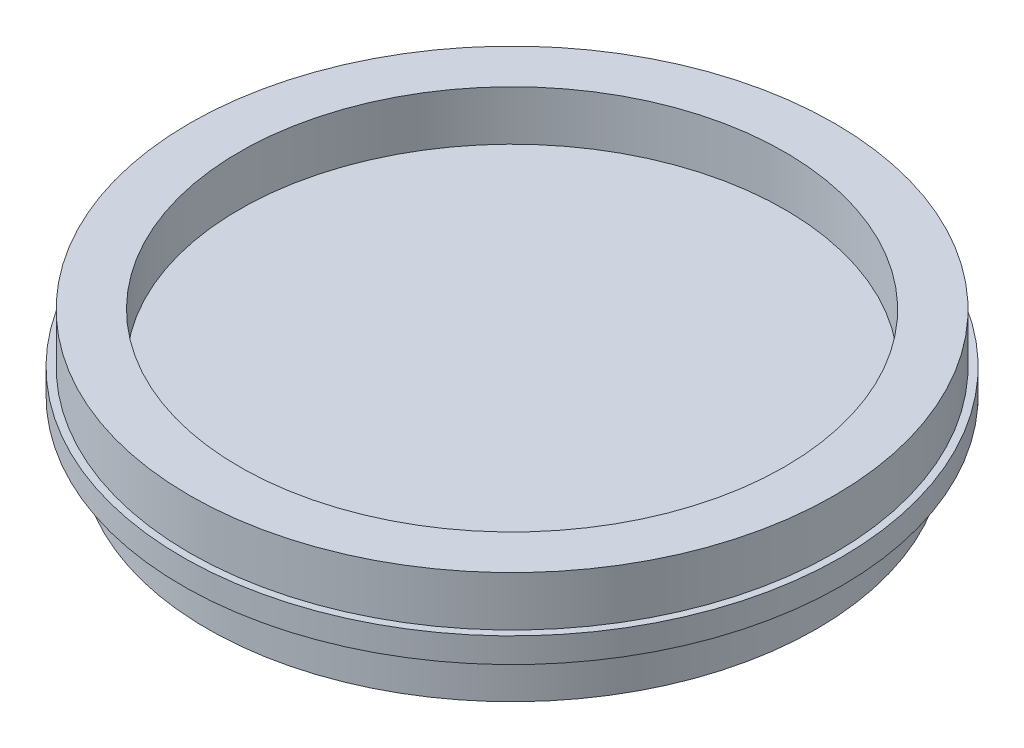
ISO-10303-21;
HEADER;
FILE_DESCRIPTION(('STEP AP214'),'2;1');
FILE_NAME('part.step','',(''),(''),'','','');
FILE_SCHEMA(('AUTOMOTIVE_DESIGN { 1 0 10303 214 1 1 1 1 }'));
ENDSEC;
DATA;
#1=APPLICATION_CONTEXT('core data for automotive mechanical design processes');
#2=APPLICATION_PROTOCOL_DEFINITION('international standard','automotive_design',2000,#1);
#3=PRODUCT_CONTEXT('',#1,'mechanical');
#4=PRODUCT('Part','Part','',(#3));
#5=PRODUCT_RELATED_PRODUCT_CATEGORY('part','',(#4));
#6=PRODUCT_DEFINITION_FORMATION('','',#4);
#7=PRODUCT_DEFINITION_CONTEXT('part definition',#1,'design');
#8=PRODUCT_DEFINITION('design','',#6,#7);
#9=PRODUCT_DEFINITION_SHAPE('','',#8);
#10=(LENGTH_UNIT() NAMED_UNIT(*) SI_UNIT(.MILLI.,.METRE.));
#11=(NAMED_UNIT(*) PLANE_ANGLE_UNIT() SI_UNIT($,.RADIAN.));
#12=(NAMED_UNIT(*) SI_UNIT($,.STERADIAN.) SOLID_ANGLE_UNIT());
#13=UNCERTAINTY_MEASURE_WITH_UNIT(LENGTH_MEASURE(1.E-05),#10,'distance_accuracy_value','');
#14=(GEOMETRIC_REPRESENTATION_CONTEXT(3) GLOBAL_UNCERTAINTY_ASSIGNED_CONTEXT((#13)) GLOBAL_UNIT_ASSIGNED_CONTEXT((#10,
#11,#12)) REPRESENTATION_CONTEXT('',''));
#15=CARTESIAN_POINT('',(0.,0.,0.));
#16=DIRECTION('',(0.,0.,1.));
#17=DIRECTION('',(1.,0.,0.));
#18=AXIS2_PLACEMENT_3D('',#15,#16,#17);
#19=CARTESIAN_POINT('',(0.,0.,0.));
#20=DIRECTION('',(0.,-1.,0.));
#21=DIRECTION('',(1.,0.,0.));
#22=AXIS2_PLACEMENT_3D('',#19,#20,#21);
#23=CYLINDRICAL_SURFACE('',#22,84.1374999999998);
#24=CARTESIAN_POINT('',(-1.84780982659883E-13,3454.4,0.));
#25=DIRECTION('',(0.,-1.,0.));
#26=DIRECTION('',(1.,0.,0.));
#27=AXIS2_PLACEMENT_3D('',#24,#25,#26);
#28=CIRCLE('',#27,84.1374999999998);
#29=CARTESIAN_POINT('',(84.1374999999996,3454.4,0.));
#30=VERTEX_POINT('',#29);
#31=EDGE_CURVE('E65',#30,#30,#28,.T.);
#32=ORIENTED_EDGE('',*,*,#31,.F.);
#33=EDGE_LOOP('',(#32));
#34=FACE_BOUND('',#33,.T.);
#35=CARTESIAN_POINT('',(-1.8512065358389E-13,3460.75,0.));
#36=DIRECTION('',(0.,-1.,0.));
#37=DIRECTION('',(1.,0.,0.));
#38=AXIS2_PLACEMENT_3D('',#35,#36,#37);
#39=CIRCLE('',#38,84.1374999999998);
#40=CARTESIAN_POINT('',(84.1374999999996,3460.75,0.));
#41=VERTEX_POINT('',#40);
#42=EDGE_CURVE('E10',#41,#41,#39,.T.);
#43=ORIENTED_EDGE('',*,*,#42,.T.);
#44=EDGE_LOOP('',(#43));
#45=FACE_BOUND('',#44,.T.);
#46=ADVANCED_FACE('F31',(#34,#45),#23,.T.);
#47=CARTESIAN_POINT('',(-84.1375,3460.75,0.));
#48=DIRECTION('',(0.,-1.,0.));
#49=DIRECTION('',(1.,0.,0.));
#50=AXIS2_PLACEMENT_3D('',#47,#48,#49);
#51=PLANE('',#50);
#52=ORIENTED_EDGE('',*,*,#42,.F.);
#53=EDGE_LOOP('',(#52));
#54=FACE_BOUND('',#53,.T.);
#55=CARTESIAN_POINT('',(-1.8512065358389E-13,3460.75,0.));
#56=DIRECTION('',(0.,-1.,0.));
#57=DIRECTION('',(1.,0.,0.));
#58=AXIS2_PLACEMENT_3D('',#55,#56,#57);
#59=CIRCLE('',#58,82.3086999999998);
#60=CARTESIAN_POINT('',(82.3086999999996,3460.75,0.));
#61=VERTEX_POINT('',#60);
#62=EDGE_CURVE('E37',#61,#61,#59,.T.);
#63=ORIENTED_EDGE('',*,*,#62,.T.);
#64=EDGE_LOOP('',(#63));
#65=FACE_BOUND('',#64,.T.);
#66=ADVANCED_FACE('F72',(#54,#65),#51,.F.);
#67=CARTESIAN_POINT('',(0.,0.,0.));
#68=DIRECTION('',(0.,-1.,0.));
#69=DIRECTION('',(1.,0.,0.));
#70=AXIS2_PLACEMENT_3D('',#67,#68,#69);
#71=CYLINDRICAL_SURFACE('',#70,82.3086999999998);
#72=ORIENTED_EDGE('',*,*,#62,.F.);
#73=EDGE_LOOP('',(#72));
#74=FACE_BOUND('',#73,.T.);
#75=CARTESIAN_POINT('',(-1.85799995431904E-13,3473.45,0.));
#76=DIRECTION('',(0.,-1.,0.));
#77=DIRECTION('',(1.,0.,0.));
#78=AXIS2_PLACEMENT_3D('',#75,#76,#77);
#79=CIRCLE('',#78,82.3086999999998);
#80=CARTESIAN_POINT('',(82.3086999999996,3473.45,0.));
#81=VERTEX_POINT('',#80);
#82=EDGE_CURVE('E41',#81,#81,#79,.T.);
#83=ORIENTED_EDGE('',*,*,#82,.T.);
#84=EDGE_LOOP('',(#83));
#85=FACE_BOUND('',#84,.T.);
#86=ADVANCED_FACE('F76',(#74,#85),#71,.T.);
#87=CARTESIAN_POINT('',(-82.3087,3473.45,0.));
#88=DIRECTION('',(0.,-1.,0.));
#89=DIRECTION('',(1.,0.,0.));
#90=AXIS2_PLACEMENT_3D('',#87,#88,#89);
#91=PLANE('',#90);
#92=ORIENTED_EDGE('',*,*,#82,.F.);
#93=EDGE_LOOP('',(#92));
#94=FACE_BOUND('',#93,.T.);
#95=CARTESIAN_POINT('',(-1.85799995431904E-13,3473.45,0.));
#96=DIRECTION('',(0.,-1.,0.));
#97=DIRECTION('',(1.,0.,0.));
#98=AXIS2_PLACEMENT_3D('',#95,#96,#97);
#99=CIRCLE('',#98,69.6086999999998);
#100=CARTESIAN_POINT('',(69.6086999999996,3473.45,0.));
#101=VERTEX_POINT('',#100);
#102=EDGE_CURVE('E45',#101,#101,#99,.T.);
#103=ORIENTED_EDGE('',*,*,#102,.T.);
#104=EDGE_LOOP('',(#103));
#105=FACE_BOUND('',#104,.T.);
#106=ADVANCED_FACE('F81',(#94,#105),#91,.F.);
#107=CARTESIAN_POINT('',(0.,0.,0.));
#108=DIRECTION('',(0.,-1.,0.));
#109=DIRECTION('',(1.,0.,0.));
#110=AXIS2_PLACEMENT_3D('',#107,#108,#109);
#111=CYLINDRICAL_SURFACE('',#110,69.6086999999998);
#112=ORIENTED_EDGE('',*,*,#102,.F.);
#113=EDGE_LOOP('',(#112));
#114=FACE_BOUND('',#113,.T.);
#115=CARTESIAN_POINT('',(-1.8512065358389E-13,3460.75,0.));
#116=DIRECTION('',(0.,-1.,0.));
#117=DIRECTION('',(1.,0.,0.));
#118=AXIS2_PLACEMENT_3D('',#115,#116,#117);
#119=CIRCLE('',#118,69.6086999999998);
#120=CARTESIAN_POINT('',(69.6086999999996,3460.75,0.));
#121=VERTEX_POINT('',#120);
#122=EDGE_CURVE('E50',#121,#121,#119,.T.);
#123=ORIENTED_EDGE('',*,*,#122,.T.);
#124=EDGE_LOOP('',(#123));
#125=FACE_BOUND('',#124,.T.);
#126=ADVANCED_FACE('F87',(#114,#125),#111,.F.);
#127=CARTESIAN_POINT('',(-69.6087,3460.75,0.));
#128=DIRECTION('',(0.,-1.,0.));
#129=DIRECTION('',(1.,0.,0.));
#130=AXIS2_PLACEMENT_3D('',#127,#128,#129);
#131=PLANE('',#130);
#132=ORIENTED_EDGE('',*,*,#122,.F.);
#133=EDGE_LOOP('',(#132));
#134=FACE_BOUND('',#133,.T.);
#135=ADVANCED_FACE('F91',(#134),#131,.F.);
#136=CARTESIAN_POINT('',(-65.0875,3454.4,0.));
#137=DIRECTION('',(0.,1.,0.));
#138=DIRECTION('',(-1.,0.,0.));
#139=AXIS2_PLACEMENT_3D('',#136,#137,#138);
#140=PLANE('',#139);
#141=CARTESIAN_POINT('',(-1.84780982659883E-13,3454.4,0.));
#142=DIRECTION('',(0.,-1.,0.));
#143=DIRECTION('',(1.,0.,0.));
#144=AXIS2_PLACEMENT_3D('',#141,#142,#143);
#145=CIRCLE('',#144,65.0874999999999);
#146=CARTESIAN_POINT('',(65.0874999999997,3454.4,0.));
#147=VERTEX_POINT('',#146);
#148=EDGE_CURVE('E53',#147,#147,#145,.T.);
#149=ORIENTED_EDGE('',*,*,#148,.T.);
#150=EDGE_LOOP('',(#149));
#151=FACE_BOUND('',#150,.T.);
#152=ADVANCED_FACE('F95',(#151),#140,.F.);
#153=CARTESIAN_POINT('',(0.,0.,0.));
#154=DIRECTION('',(0.,-1.,0.));
#155=DIRECTION('',(1.,0.,0.));
#156=AXIS2_PLACEMENT_3D('',#153,#154,#155);
#157=CYLINDRICAL_SURFACE('',#156,65.0874999999999);
#158=ORIENTED_EDGE('',*,*,#148,.F.);
#159=EDGE_LOOP('',(#158));
#160=FACE_BOUND('',#159,.T.);
#161=CARTESIAN_POINT('',(-1.84101640811869E-13,3441.7,0.));
#162=DIRECTION('',(0.,-1.,0.));
#163=DIRECTION('',(1.,0.,0.));
#164=AXIS2_PLACEMENT_3D('',#161,#162,#163);
#165=CIRCLE('',#164,65.0874999999999);
#166=CARTESIAN_POINT('',(65.0874999999997,3441.7,0.));
#167=VERTEX_POINT('',#166);
#168=EDGE_CURVE('E56',#167,#167,#165,.T.);
#169=ORIENTED_EDGE('',*,*,#168,.T.);
#170=EDGE_LOOP('',(#169));
#171=FACE_BOUND('',#170,.T.);
#172=ADVANCED_FACE('F99',(#160,#171),#157,.F.);
#173=CARTESIAN_POINT('',(-65.0875,3441.7,0.));
#174=DIRECTION('',(0.,1.,0.));
#175=DIRECTION('',(-1.,0.,0.));
#176=AXIS2_PLACEMENT_3D('',#173,#174,#175);
#177=PLANE('',#176);
#178=ORIENTED_EDGE('',*,*,#168,.F.);
#179=EDGE_LOOP('',(#178));
#180=FACE_BOUND('',#179,.T.);
#181=CARTESIAN_POINT('',(-1.84101640811869E-13,3441.7,0.));
#182=DIRECTION('',(0.,-1.,0.));
#183=DIRECTION('',(1.,0.,0.));
#184=AXIS2_PLACEMENT_3D('',#181,#182,#183);
#185=CIRCLE('',#184,77.7874999999999);
#186=CARTESIAN_POINT('',(77.7874999999997,3441.7,0.));
#187=VERTEX_POINT('',#186);
#188=EDGE_CURVE('E59',#187,#187,#185,.T.);
#189=ORIENTED_EDGE('',*,*,#188,.T.);
#190=EDGE_LOOP('',(#189));
#191=FACE_BOUND('',#190,.T.);
#192=ADVANCED_FACE('F103',(#180,#191),#177,.F.);
#193=CARTESIAN_POINT('',(0.,0.,0.));
#194=DIRECTION('',(0.,-1.,0.));
#195=DIRECTION('',(1.,0.,0.));
#196=AXIS2_PLACEMENT_3D('',#193,#194,#195);
#197=CYLINDRICAL_SURFACE('',#196,77.7874999999999);
#198=ORIENTED_EDGE('',*,*,#188,.F.);
#199=EDGE_LOOP('',(#198));
#200=FACE_BOUND('',#199,.T.);
#201=CARTESIAN_POINT('',(-1.84780982659883E-13,3454.4,0.));
#202=DIRECTION('',(0.,-1.,0.));
#203=DIRECTION('',(1.,0.,0.));
#204=AXIS2_PLACEMENT_3D('',#201,#202,#203);
#205=CIRCLE('',#204,77.7874999999999);
#206=CARTESIAN_POINT('',(77.7874999999997,3454.4,0.));
#207=VERTEX_POINT('',#206);
#208=EDGE_CURVE('E62',#207,#207,#205,.T.);
#209=ORIENTED_EDGE('',*,*,#208,.T.);
#210=EDGE_LOOP('',(#209));
#211=FACE_BOUND('',#210,.T.);
#212=ADVANCED_FACE('F107',(#200,#211),#197,.T.);
#213=CARTESIAN_POINT('',(-77.7875,3454.4,0.));
#214=DIRECTION('',(0.,1.,0.));
#215=DIRECTION('',(-1.,0.,0.));
#216=AXIS2_PLACEMENT_3D('',#213,#214,#215);
#217=PLANE('',#216);
#218=ORIENTED_EDGE('',*,*,#208,.F.);
#219=EDGE_LOOP('',(#218));
#220=FACE_BOUND('',#219,.T.);
#221=ORIENTED_EDGE('',*,*,#31,.T.);
#222=EDGE_LOOP('',(#221));
#223=FACE_BOUND('',#222,.T.);
#224=ADVANCED_FACE('F69',(#220,#223),#217,.F.);
#225=CLOSED_SHELL('',(#46,#66,#86,#106,#126,#135,#152,#172,#192,#212,#224));
#226=MANIFOLD_SOLID_BREP('B2',#225);
#227=ADVANCED_BREP_SHAPE_REPRESENTATION('',(#18,#226),#14);
#228=SHAPE_DEFINITION_REPRESENTATION(#9,#227);
ENDSEC;
END-ISO-10303-21;
